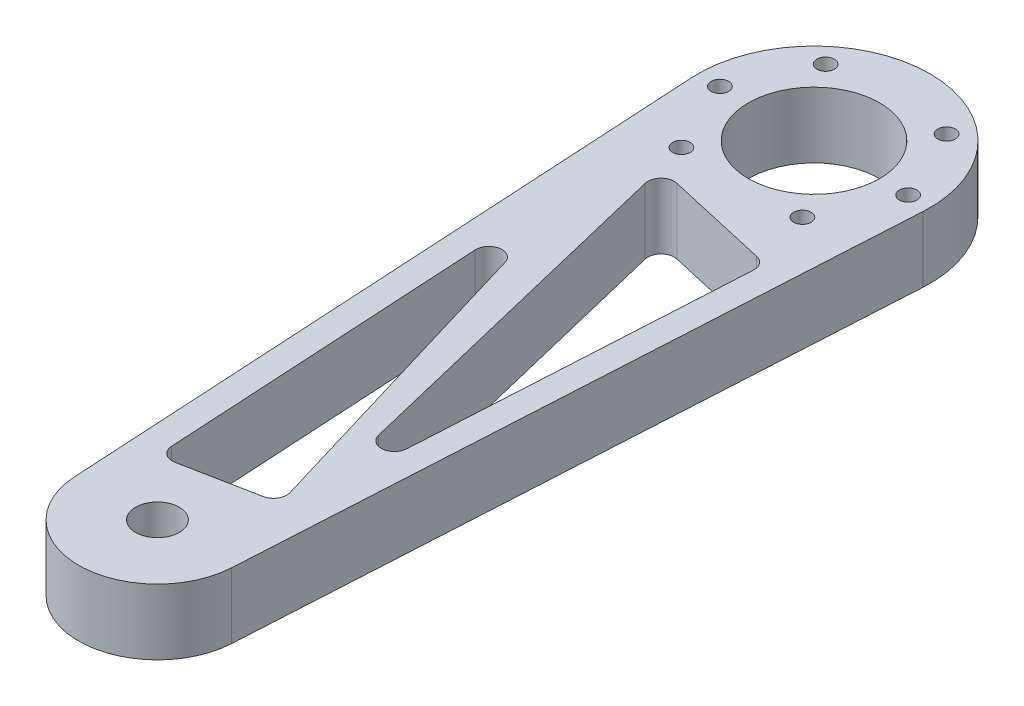
ISO-10303-21;
HEADER;
FILE_DESCRIPTION(('STEP AP214'),'2;1');
FILE_NAME('part.step','',(''),(''),'','','');
FILE_SCHEMA(('AUTOMOTIVE_DESIGN { 1 0 10303 214 1 1 1 1 }'));
ENDSEC;
DATA;
#1=APPLICATION_CONTEXT('core data for automotive mechanical design processes');
#2=APPLICATION_PROTOCOL_DEFINITION('international standard','automotive_design',2000,#1);
#3=PRODUCT_CONTEXT('',#1,'mechanical');
#4=PRODUCT('Part','Part','',(#3));
#5=PRODUCT_RELATED_PRODUCT_CATEGORY('part','',(#4));
#6=PRODUCT_DEFINITION_FORMATION('','',#4);
#7=PRODUCT_DEFINITION_CONTEXT('part definition',#1,'design');
#8=PRODUCT_DEFINITION('design','',#6,#7);
#9=PRODUCT_DEFINITION_SHAPE('','',#8);
#10=(LENGTH_UNIT() NAMED_UNIT(*) SI_UNIT(.MILLI.,.METRE.));
#11=(NAMED_UNIT(*) PLANE_ANGLE_UNIT() SI_UNIT($,.RADIAN.));
#12=(NAMED_UNIT(*) SI_UNIT($,.STERADIAN.) SOLID_ANGLE_UNIT());
#13=UNCERTAINTY_MEASURE_WITH_UNIT(LENGTH_MEASURE(1.E-05),#10,'distance_accuracy_value','');
#14=(GEOMETRIC_REPRESENTATION_CONTEXT(3) GLOBAL_UNCERTAINTY_ASSIGNED_CONTEXT((#13)) GLOBAL_UNIT_ASSIGNED_CONTEXT((#10,
#11,#12)) REPRESENTATION_CONTEXT('',''));
#15=CARTESIAN_POINT('',(0.,0.,0.));
#16=DIRECTION('',(0.,0.,1.));
#17=DIRECTION('',(1.,0.,0.));
#18=AXIS2_PLACEMENT_3D('',#15,#16,#17);
#19=CARTESIAN_POINT('',(0.,15.,0.));
#20=DIRECTION('',(0.,1.,0.));
#21=DIRECTION('',(0.,0.,1.));
#22=AXIS2_PLACEMENT_3D('',#19,#20,#21);
#23=PLANE('',#22);
#24=CARTESIAN_POINT('',(-13.8199336082606,15.,-166.469955527058));
#25=DIRECTION('',(0.,1.,0.));
#26=DIRECTION('',(-0.766044443118979,0.,0.642787609686538));
#27=AXIS2_PLACEMENT_3D('',#24,#25,#26);
#28=CIRCLE('',#27,2.);
#29=CARTESIAN_POINT('',(-15.3520224944985,15.,-165.184380307685));
#30=VERTEX_POINT('',#29);
#31=EDGE_CURVE('E369',#30,#30,#28,.T.);
#32=ORIENTED_EDGE('',*,*,#31,.F.);
#33=EDGE_LOOP('',(#32));
#34=FACE_BOUND('',#33,.T.);
#35=CARTESIAN_POINT('',(13.8199336082606,15.,-133.530044472942));
#36=DIRECTION('',(0.,1.,0.));
#37=DIRECTION('',(-0.766044443118979,0.,0.642787609686538));
#38=AXIS2_PLACEMENT_3D('',#35,#36,#37);
#39=CIRCLE('',#38,2.);
#40=CARTESIAN_POINT('',(12.2878447220226,15.,-132.244469253569));
#41=VERTEX_POINT('',#40);
#42=EDGE_CURVE('E375',#41,#41,#39,.T.);
#43=ORIENTED_EDGE('',*,*,#42,.F.);
#44=EDGE_LOOP('',(#43));
#45=FACE_BOUND('',#44,.T.);
#46=CARTESIAN_POINT('',(-13.8199336082606,15.,-133.530044472942));
#47=DIRECTION('',(0.,1.,0.));
#48=DIRECTION('',(0.766044443118979,0.,0.642787609686538));
#49=AXIS2_PLACEMENT_3D('',#46,#47,#48);
#50=CIRCLE('',#49,2.);
#51=CARTESIAN_POINT('',(-12.2878447220226,15.,-132.244469253569));
#52=VERTEX_POINT('',#51);
#53=EDGE_CURVE('E384',#52,#52,#50,.T.);
#54=ORIENTED_EDGE('',*,*,#53,.F.);
#55=EDGE_LOOP('',(#54));
#56=FACE_BOUND('',#55,.T.);
#57=CARTESIAN_POINT('',(13.8199336082606,15.,-166.469955527058));
#58=DIRECTION('',(0.,1.,0.));
#59=DIRECTION('',(0.766044443118979,0.,0.642787609686538));
#60=AXIS2_PLACEMENT_3D('',#57,#58,#59);
#61=CIRCLE('',#60,2.);
#62=CARTESIAN_POINT('',(15.3520224944985,15.,-165.184380307685));
#63=VERTEX_POINT('',#62);
#64=EDGE_CURVE('E372',#63,#63,#61,.T.);
#65=ORIENTED_EDGE('',*,*,#64,.F.);
#66=EDGE_LOOP('',(#65));
#67=FACE_BOUND('',#66,.T.);
#68=CARTESIAN_POINT('',(-21.5,15.,-150.));
#69=DIRECTION('',(0.,1.,0.));
#70=DIRECTION('',(0.,0.,1.));
#71=AXIS2_PLACEMENT_3D('',#68,#69,#70);
#72=CIRCLE('',#71,2.);
#73=CARTESIAN_POINT('',(-21.5,15.,-148.));
#74=VERTEX_POINT('',#73);
#75=EDGE_CURVE('E396',#74,#74,#72,.T.);
#76=ORIENTED_EDGE('',*,*,#75,.F.);
#77=EDGE_LOOP('',(#76));
#78=FACE_BOUND('',#77,.T.);
#79=CARTESIAN_POINT('',(21.5,15.,-150.));
#80=DIRECTION('',(0.,1.,0.));
#81=DIRECTION('',(0.,0.,1.));
#82=AXIS2_PLACEMENT_3D('',#79,#80,#81);
#83=CIRCLE('',#82,2.);
#84=CARTESIAN_POINT('',(21.5,15.,-148.));
#85=VERTEX_POINT('',#84);
#86=EDGE_CURVE('E383',#85,#85,#83,.T.);
#87=ORIENTED_EDGE('',*,*,#86,.F.);
#88=EDGE_LOOP('',(#87));
#89=FACE_BOUND('',#88,.T.);
#90=CARTESIAN_POINT('',(0.,15.,0.));
#91=DIRECTION('',(0.,1.,0.));
#92=DIRECTION('',(0.,0.,1.));
#93=AXIS2_PLACEMENT_3D('',#90,#91,#92);
#94=CIRCLE('',#93,5.);
#95=CARTESIAN_POINT('',(0.,15.,5.));
#96=VERTEX_POINT('',#95);
#97=EDGE_CURVE('E268',#96,#96,#94,.T.);
#98=ORIENTED_EDGE('',*,*,#97,.F.);
#99=EDGE_LOOP('',(#98));
#100=FACE_BOUND('',#99,.T.);
#101=CARTESIAN_POINT('',(0.,15.,0.));
#102=DIRECTION('',(0.,1.,0.));
#103=DIRECTION('',(0.,0.,1.));
#104=AXIS2_PLACEMENT_3D('',#101,#102,#103);
#105=CIRCLE('',#104,18.);
#106=CARTESIAN_POINT('',(-17.971076762398,15.,1.02));
#107=VERTEX_POINT('',#106);
#108=CARTESIAN_POINT('',(17.971076762398,15.,1.02));
#109=VERTEX_POINT('',#108);
#110=EDGE_CURVE('E160',#107,#109,#105,.T.);
#111=ORIENTED_EDGE('',*,*,#110,.T.);
#112=DIRECTION('',(0.0566666666666667,0.,-0.998393153466553));
#113=VECTOR('',#112,1.);
#114=CARTESIAN_POINT('',(17.971076762398,15.,1.02));
#115=LINE('',#114,#113);
#116=CARTESIAN_POINT('',(26.4574185668637,15.,-148.498333333333));
#117=VERTEX_POINT('',#116);
#118=EDGE_CURVE('E149',#109,#117,#115,.T.);
#119=ORIENTED_EDGE('',*,*,#118,.T.);
#120=CARTESIAN_POINT('',(0.,15.,-150.));
#121=DIRECTION('',(0.,1.,0.));
#122=DIRECTION('',(0.,0.,-1.));
#123=AXIS2_PLACEMENT_3D('',#120,#121,#122);
#124=CIRCLE('',#123,26.5);
#125=CARTESIAN_POINT('',(-26.4574185668637,15.,-148.498333333333));
#126=VERTEX_POINT('',#125);
#127=EDGE_CURVE('E159',#117,#126,#124,.T.);
#128=ORIENTED_EDGE('',*,*,#127,.T.);
#129=DIRECTION('',(0.0566666666666667,0.,0.998393153466553));
#130=VECTOR('',#129,1.);
#131=CARTESIAN_POINT('',(-17.971076762398,15.,1.02));
#132=LINE('',#131,#130);
#133=EDGE_CURVE('E165',#126,#107,#132,.T.);
#134=ORIENTED_EDGE('',*,*,#133,.T.);
#135=EDGE_LOOP('',(#111,#119,#128,#134));
#136=FACE_BOUND('',#135,.T.);
#137=CARTESIAN_POINT('',(0.,15.,-150.));
#138=DIRECTION('',(0.,1.,0.));
#139=DIRECTION('',(0.,0.,1.));
#140=AXIS2_PLACEMENT_3D('',#137,#138,#139);
#141=CIRCLE('',#140,15.);
#142=CARTESIAN_POINT('',(0.,15.,-135.));
#143=VERTEX_POINT('',#142);
#144=EDGE_CURVE('E262',#143,#143,#141,.T.);
#145=ORIENTED_EDGE('',*,*,#144,.F.);
#146=EDGE_LOOP('',(#145));
#147=FACE_BOUND('',#146,.T.);
#148=DIRECTION('',(-0.286666756449605,0.,-0.958030360033889));
#149=VECTOR('',#148,1.);
#150=CARTESIAN_POINT('',(-18.5543851913669,15.,-115.139490738387));
#151=LINE('',#150,#149);
#152=CARTESIAN_POINT('',(9.76560528215196,15.,-20.4950645568282));
#153=VERTEX_POINT('',#152);
#154=CARTESIAN_POINT('',(-11.2390630531947,15.,-90.6919378076061));
#155=VERTEX_POINT('',#154);
#156=EDGE_CURVE('E248',#153,#155,#151,.T.);
#157=ORIENTED_EDGE('',*,*,#156,.F.);
#158=CARTESIAN_POINT('',(6.8915142020503,15.,-19.6350642874794));
#159=DIRECTION('',(0.,1.,0.));
#160=DIRECTION('',(0.,0.,1.));
#161=AXIS2_PLACEMENT_3D('',#158,#159,#160);
#162=CIRCLE('',#161,3.);
#163=CARTESIAN_POINT('',(7.47066200637673,15.,-16.6914970943031));
#164=VERTEX_POINT('',#163);
#165=EDGE_CURVE('E11',#153,#164,#162,.F.);
#166=ORIENTED_EDGE('',*,*,#165,.T.);
#167=DIRECTION('',(0.981189064392104,0.,-0.19304926810881));
#168=VECTOR('',#167,1.);
#169=CARTESIAN_POINT('',(10.7128519545465,15.,-17.3293990229714));
#170=LINE('',#169,#168);
#171=CARTESIAN_POINT('',(-9.3618110753663,15.,-13.3797025311371));
#172=VERTEX_POINT('',#171);
#173=EDGE_CURVE('E246',#172,#164,#170,.T.);
#174=ORIENTED_EDGE('',*,*,#173,.F.);
#175=CARTESIAN_POINT('',(-9.94095887969273,15.,-16.3232697243134));
#176=DIRECTION('',(0.,1.,0.));
#177=DIRECTION('',(0.,0.,1.));
#178=AXIS2_PLACEMENT_3D('',#175,#176,#177);
#179=CIRCLE('',#178,3.);
#180=CARTESIAN_POINT('',(-12.9361383400924,15.,-16.1532697243134));
#181=VERTEX_POINT('',#180);
#182=EDGE_CURVE('E222',#172,#181,#179,.F.);
#183=ORIENTED_EDGE('',*,*,#182,.T.);
#184=DIRECTION('',(0.0566666666666666,0.,0.998393153466553));
#185=VECTOR('',#184,1.);
#186=CARTESIAN_POINT('',(-12.7409809539486,15.,-12.7148497565296));
#187=LINE('',#186,#185);
#188=CARTESIAN_POINT('',(-17.108333593696,15.,-89.6619375382572));
#189=VERTEX_POINT('',#188);
#190=EDGE_CURVE('E250',#189,#181,#187,.T.);
#191=ORIENTED_EDGE('',*,*,#190,.F.);
#192=CARTESIAN_POINT('',(-14.1131541332963,15.,-89.8319375382572));
#193=DIRECTION('',(0.,1.,0.));
#194=DIRECTION('',(0.,0.,1.));
#195=AXIS2_PLACEMENT_3D('',#192,#193,#194);
#196=CIRCLE('',#195,3.);
#197=EDGE_CURVE('E218',#189,#155,#196,.F.);
#198=ORIENTED_EDGE('',*,*,#197,.T.);
#199=EDGE_LOOP('',(#157,#166,#174,#183,#191,#198));
#200=FACE_BOUND('',#199,.T.);
#201=DIRECTION('',(0.234668209936248,0.,0.972075527541619));
#202=VECTOR('',#201,1.);
#203=CARTESIAN_POINT('',(-12.,15.,-127.));
#204=LINE('',#203,#202);
#205=CARTESIAN_POINT('',(-10.8653488920019,15.,-122.299889257763));
#206=VERTEX_POINT('',#205);
#207=CARTESIAN_POINT('',(8.52161939319863,15.,-41.992473829023));
#208=VERTEX_POINT('',#207);
#209=EDGE_CURVE('E407',#206,#208,#204,.T.);
#210=ORIENTED_EDGE('',*,*,#209,.F.);
#211=CARTESIAN_POINT('',(-7.94912230937701,15.,-123.003893887571));
#212=DIRECTION('',(0.,1.,0.));
#213=DIRECTION('',(0.,0.,1.));
#214=AXIS2_PLACEMENT_3D('',#211,#212,#213);
#215=CIRCLE('',#214,3.);
#216=CARTESIAN_POINT('',(-7.28487950298156,15.,-125.929433409463));
#217=VERTEX_POINT('',#216);
#218=EDGE_CURVE('E214',#206,#217,#215,.F.);
#219=ORIENTED_EDGE('',*,*,#218,.T.);
#220=DIRECTION('',(-0.975179840630658,0.,-0.221414268798477));
#221=VECTOR('',#220,1.);
#222=CARTESIAN_POINT('',(18.8302573337206,15.,-120.));
#223=LINE('',#222,#221);
#224=CARTESIAN_POINT('',(16.3555160897141,15.,-120.561889202563));
#225=VERTEX_POINT('',#224);
#226=EDGE_CURVE('E404',#225,#217,#223,.T.);
#227=ORIENTED_EDGE('',*,*,#226,.F.);
#228=CARTESIAN_POINT('',(15.6912732833187,15.,-117.636349680671));
#229=DIRECTION('',(0.,1.,0.));
#230=DIRECTION('',(0.,0.,1.));
#231=AXIS2_PLACEMENT_3D('',#228,#229,#230);
#232=CIRCLE('',#231,3.);
#233=CARTESIAN_POINT('',(18.6864527437183,15.,-117.466349680671));
#234=VERTEX_POINT('',#233);
#235=EDGE_CURVE('E210',#225,#234,#232,.F.);
#236=ORIENTED_EDGE('',*,*,#235,.T.);
#237=DIRECTION('',(0.0566666666666667,0.,-0.998393153466553));
#238=VECTOR('',#237,1.);
#239=CARTESIAN_POINT('',(13.2832157063432,15.,-22.2683226570439));
#240=LINE('',#239,#238);
#241=CARTESIAN_POINT('',(14.4330254362231,15.,-42.5264784588318));
#242=VERTEX_POINT('',#241);
#243=EDGE_CURVE('E260',#242,#234,#240,.T.);
#244=ORIENTED_EDGE('',*,*,#243,.F.);
#245=CARTESIAN_POINT('',(11.4378459758235,15.,-42.6964784588318));
#246=DIRECTION('',(0.,1.,0.));
#247=DIRECTION('',(0.,0.,1.));
#248=AXIS2_PLACEMENT_3D('',#245,#246,#247);
#249=CIRCLE('',#248,3.);
#250=EDGE_CURVE('E226',#242,#208,#249,.F.);
#251=ORIENTED_EDGE('',*,*,#250,.T.);
#252=EDGE_LOOP('',(#210,#219,#227,#236,#244,#251));
#253=FACE_BOUND('',#252,.T.);
#254=ADVANCED_FACE('F36',(#34,#45,#56,#67,#78,#89,#100,#136,#147,#200,#253),#23,.T.);
#255=CARTESIAN_POINT('',(0.,0.,0.));
#256=DIRECTION('',(0.,1.,0.));
#257=DIRECTION('',(0.,0.,1.));
#258=AXIS2_PLACEMENT_3D('',#255,#256,#257);
#259=PLANE('',#258);
#260=CARTESIAN_POINT('',(-13.8199336082606,0.,-166.469955527058));
#261=DIRECTION('',(0.,1.,0.));
#262=DIRECTION('',(-0.766044443118979,0.,0.642787609686538));
#263=AXIS2_PLACEMENT_3D('',#260,#261,#262);
#264=CIRCLE('',#263,2.);
#265=CARTESIAN_POINT('',(-15.3520224944985,0.,-165.184380307685));
#266=VERTEX_POINT('',#265);
#267=EDGE_CURVE('E367',#266,#266,#264,.T.);
#268=ORIENTED_EDGE('',*,*,#267,.T.);
#269=EDGE_LOOP('',(#268));
#270=FACE_BOUND('',#269,.T.);
#271=CARTESIAN_POINT('',(13.8199336082606,0.,-133.530044472942));
#272=DIRECTION('',(0.,1.,0.));
#273=DIRECTION('',(-0.766044443118979,0.,0.642787609686538));
#274=AXIS2_PLACEMENT_3D('',#271,#272,#273);
#275=CIRCLE('',#274,2.);
#276=CARTESIAN_POINT('',(12.2878447220226,0.,-132.244469253569));
#277=VERTEX_POINT('',#276);
#278=EDGE_CURVE('E370',#277,#277,#275,.T.);
#279=ORIENTED_EDGE('',*,*,#278,.T.);
#280=EDGE_LOOP('',(#279));
#281=FACE_BOUND('',#280,.T.);
#282=CARTESIAN_POINT('',(-13.8199336082606,0.,-133.530044472942));
#283=DIRECTION('',(0.,1.,0.));
#284=DIRECTION('',(0.766044443118979,0.,0.642787609686538));
#285=AXIS2_PLACEMENT_3D('',#282,#283,#284);
#286=CIRCLE('',#285,2.);
#287=CARTESIAN_POINT('',(-12.2878447220226,0.,-132.244469253569));
#288=VERTEX_POINT('',#287);
#289=EDGE_CURVE('E380',#288,#288,#286,.T.);
#290=ORIENTED_EDGE('',*,*,#289,.T.);
#291=EDGE_LOOP('',(#290));
#292=FACE_BOUND('',#291,.T.);
#293=CARTESIAN_POINT('',(13.8199336082606,0.,-166.469955527058));
#294=DIRECTION('',(0.,1.,0.));
#295=DIRECTION('',(0.766044443118979,0.,0.642787609686538));
#296=AXIS2_PLACEMENT_3D('',#293,#294,#295);
#297=CIRCLE('',#296,2.);
#298=CARTESIAN_POINT('',(15.3520224944985,0.,-165.184380307685));
#299=VERTEX_POINT('',#298);
#300=EDGE_CURVE('E387',#299,#299,#297,.T.);
#301=ORIENTED_EDGE('',*,*,#300,.T.);
#302=EDGE_LOOP('',(#301));
#303=FACE_BOUND('',#302,.T.);
#304=CARTESIAN_POINT('',(-21.5,0.,-150.));
#305=DIRECTION('',(0.,1.,0.));
#306=DIRECTION('',(0.,0.,1.));
#307=AXIS2_PLACEMENT_3D('',#304,#305,#306);
#308=CIRCLE('',#307,2.);
#309=CARTESIAN_POINT('',(-21.5,0.,-148.));
#310=VERTEX_POINT('',#309);
#311=EDGE_CURVE('E392',#310,#310,#308,.T.);
#312=ORIENTED_EDGE('',*,*,#311,.T.);
#313=EDGE_LOOP('',(#312));
#314=FACE_BOUND('',#313,.T.);
#315=CARTESIAN_POINT('',(21.5,0.,-150.));
#316=DIRECTION('',(0.,1.,0.));
#317=DIRECTION('',(0.,0.,1.));
#318=AXIS2_PLACEMENT_3D('',#315,#316,#317);
#319=CIRCLE('',#318,2.);
#320=CARTESIAN_POINT('',(21.5,0.,-148.));
#321=VERTEX_POINT('',#320);
#322=EDGE_CURVE('E399',#321,#321,#319,.T.);
#323=ORIENTED_EDGE('',*,*,#322,.T.);
#324=EDGE_LOOP('',(#323));
#325=FACE_BOUND('',#324,.T.);
#326=DIRECTION('',(0.0566666666666666,0.,0.998393153466553));
#327=VECTOR('',#326,1.);
#328=CARTESIAN_POINT('',(-12.7409809539486,0.,-12.7148497565296));
#329=LINE('',#328,#327);
#330=CARTESIAN_POINT('',(-17.108333593696,0.,-89.6619375382572));
#331=VERTEX_POINT('',#330);
#332=CARTESIAN_POINT('',(-12.9361383400924,0.,-16.1532697243134));
#333=VERTEX_POINT('',#332);
#334=EDGE_CURVE('E243',#331,#333,#329,.T.);
#335=ORIENTED_EDGE('',*,*,#334,.T.);
#336=CARTESIAN_POINT('',(-9.94095887969273,0.,-16.3232697243134));
#337=DIRECTION('',(0.,1.,0.));
#338=DIRECTION('',(0.,0.,1.));
#339=AXIS2_PLACEMENT_3D('',#336,#337,#338);
#340=CIRCLE('',#339,3.);
#341=CARTESIAN_POINT('',(-9.3618110753663,0.,-13.3797025311371));
#342=VERTEX_POINT('',#341);
#343=EDGE_CURVE('E220',#333,#342,#340,.T.);
#344=ORIENTED_EDGE('',*,*,#343,.T.);
#345=DIRECTION('',(0.981189064392104,0.,-0.19304926810881));
#346=VECTOR('',#345,1.);
#347=CARTESIAN_POINT('',(10.7128519545465,0.,-17.3293990229714));
#348=LINE('',#347,#346);
#349=CARTESIAN_POINT('',(7.47066200637673,0.,-16.6914970943031));
#350=VERTEX_POINT('',#349);
#351=EDGE_CURVE('E235',#342,#350,#348,.T.);
#352=ORIENTED_EDGE('',*,*,#351,.T.);
#353=CARTESIAN_POINT('',(6.8915142020503,0.,-19.6350642874794));
#354=DIRECTION('',(0.,1.,0.));
#355=DIRECTION('',(0.,0.,1.));
#356=AXIS2_PLACEMENT_3D('',#353,#354,#355);
#357=CIRCLE('',#356,3.);
#358=CARTESIAN_POINT('',(9.76560528215196,0.,-20.4950645568282));
#359=VERTEX_POINT('',#358);
#360=EDGE_CURVE('E44',#350,#359,#357,.T.);
#361=ORIENTED_EDGE('',*,*,#360,.T.);
#362=DIRECTION('',(-0.286666756449605,0.,-0.958030360033889));
#363=VECTOR('',#362,1.);
#364=CARTESIAN_POINT('',(-18.5543851913669,0.,-115.139490738387));
#365=LINE('',#364,#363);
#366=CARTESIAN_POINT('',(-11.2390630531947,0.,-90.6919378076061));
#367=VERTEX_POINT('',#366);
#368=EDGE_CURVE('E234',#359,#367,#365,.T.);
#369=ORIENTED_EDGE('',*,*,#368,.T.);
#370=CARTESIAN_POINT('',(-14.1131541332963,0.,-89.8319375382572));
#371=DIRECTION('',(0.,1.,0.));
#372=DIRECTION('',(0.,0.,1.));
#373=AXIS2_PLACEMENT_3D('',#370,#371,#372);
#374=CIRCLE('',#373,3.);
#375=EDGE_CURVE('E216',#367,#331,#374,.T.);
#376=ORIENTED_EDGE('',*,*,#375,.T.);
#377=EDGE_LOOP('',(#335,#344,#352,#361,#369,#376));
#378=FACE_BOUND('',#377,.T.);
#379=CARTESIAN_POINT('',(0.,0.,0.));
#380=DIRECTION('',(0.,1.,0.));
#381=DIRECTION('',(0.,0.,1.));
#382=AXIS2_PLACEMENT_3D('',#379,#380,#381);
#383=CIRCLE('',#382,18.);
#384=CARTESIAN_POINT('',(-17.971076762398,0.,1.02));
#385=VERTEX_POINT('',#384);
#386=CARTESIAN_POINT('',(17.971076762398,0.,1.02));
#387=VERTEX_POINT('',#386);
#388=EDGE_CURVE('E173',#385,#387,#383,.T.);
#389=ORIENTED_EDGE('',*,*,#388,.F.);
#390=DIRECTION('',(0.0566666666666667,0.,0.998393153466553));
#391=VECTOR('',#390,1.);
#392=CARTESIAN_POINT('',(-17.971076762398,0.,1.02));
#393=LINE('',#392,#391);
#394=CARTESIAN_POINT('',(-26.4574185668637,0.,-148.498333333333));
#395=VERTEX_POINT('',#394);
#396=EDGE_CURVE('E169',#395,#385,#393,.T.);
#397=ORIENTED_EDGE('',*,*,#396,.F.);
#398=CARTESIAN_POINT('',(0.,0.,-150.));
#399=DIRECTION('',(0.,1.,0.));
#400=DIRECTION('',(0.,0.,-1.));
#401=AXIS2_PLACEMENT_3D('',#398,#399,#400);
#402=CIRCLE('',#401,26.5);
#403=CARTESIAN_POINT('',(26.4574185668637,0.,-148.498333333333));
#404=VERTEX_POINT('',#403);
#405=EDGE_CURVE('E279',#404,#395,#402,.T.);
#406=ORIENTED_EDGE('',*,*,#405,.F.);
#407=DIRECTION('',(0.0566666666666667,0.,-0.998393153466553));
#408=VECTOR('',#407,1.);
#409=CARTESIAN_POINT('',(17.971076762398,0.,1.02));
#410=LINE('',#409,#408);
#411=EDGE_CURVE('E277',#387,#404,#410,.T.);
#412=ORIENTED_EDGE('',*,*,#411,.F.);
#413=EDGE_LOOP('',(#389,#397,#406,#412));
#414=FACE_BOUND('',#413,.T.);
#415=CARTESIAN_POINT('',(0.,0.,0.));
#416=DIRECTION('',(0.,1.,0.));
#417=DIRECTION('',(0.,0.,1.));
#418=AXIS2_PLACEMENT_3D('',#415,#416,#417);
#419=CIRCLE('',#418,5.);
#420=CARTESIAN_POINT('',(0.,0.,5.));
#421=VERTEX_POINT('',#420);
#422=EDGE_CURVE('E265',#421,#421,#419,.T.);
#423=ORIENTED_EDGE('',*,*,#422,.T.);
#424=EDGE_LOOP('',(#423));
#425=FACE_BOUND('',#424,.T.);
#426=CARTESIAN_POINT('',(0.,0.,-150.));
#427=DIRECTION('',(0.,1.,0.));
#428=DIRECTION('',(0.,0.,1.));
#429=AXIS2_PLACEMENT_3D('',#426,#427,#428);
#430=CIRCLE('',#429,15.);
#431=CARTESIAN_POINT('',(0.,0.,-135.));
#432=VERTEX_POINT('',#431);
#433=EDGE_CURVE('E259',#432,#432,#430,.T.);
#434=ORIENTED_EDGE('',*,*,#433,.T.);
#435=EDGE_LOOP('',(#434));
#436=FACE_BOUND('',#435,.T.);
#437=DIRECTION('',(0.0566666666666667,0.,-0.998393153466553));
#438=VECTOR('',#437,1.);
#439=CARTESIAN_POINT('',(13.2832157063432,0.,-22.2683226570439));
#440=LINE('',#439,#438);
#441=CARTESIAN_POINT('',(14.4330254362231,0.,-42.5264784588318));
#442=VERTEX_POINT('',#441);
#443=CARTESIAN_POINT('',(18.6864527437183,0.,-117.466349680671));
#444=VERTEX_POINT('',#443);
#445=EDGE_CURVE('E254',#442,#444,#440,.T.);
#446=ORIENTED_EDGE('',*,*,#445,.T.);
#447=CARTESIAN_POINT('',(15.6912732833187,0.,-117.636349680671));
#448=DIRECTION('',(0.,1.,0.));
#449=DIRECTION('',(0.,0.,1.));
#450=AXIS2_PLACEMENT_3D('',#447,#448,#449);
#451=CIRCLE('',#450,3.);
#452=CARTESIAN_POINT('',(16.3555160897141,0.,-120.561889202563));
#453=VERTEX_POINT('',#452);
#454=EDGE_CURVE('E208',#444,#453,#451,.T.);
#455=ORIENTED_EDGE('',*,*,#454,.T.);
#456=DIRECTION('',(-0.975179840630658,0.,-0.221414268798477));
#457=VECTOR('',#456,1.);
#458=CARTESIAN_POINT('',(18.8302573337206,0.,-120.));
#459=LINE('',#458,#457);
#460=CARTESIAN_POINT('',(-7.28487950298156,0.,-125.929433409463));
#461=VERTEX_POINT('',#460);
#462=EDGE_CURVE('E395',#453,#461,#459,.T.);
#463=ORIENTED_EDGE('',*,*,#462,.T.);
#464=CARTESIAN_POINT('',(-7.94912230937701,0.,-123.003893887571));
#465=DIRECTION('',(0.,1.,0.));
#466=DIRECTION('',(0.,0.,1.));
#467=AXIS2_PLACEMENT_3D('',#464,#465,#466);
#468=CIRCLE('',#467,3.);
#469=CARTESIAN_POINT('',(-10.8653488920019,0.,-122.299889257763));
#470=VERTEX_POINT('',#469);
#471=EDGE_CURVE('E212',#461,#470,#468,.T.);
#472=ORIENTED_EDGE('',*,*,#471,.T.);
#473=DIRECTION('',(0.234668209936248,0.,0.972075527541619));
#474=VECTOR('',#473,1.);
#475=CARTESIAN_POINT('',(-12.,0.,-127.));
#476=LINE('',#475,#474);
#477=CARTESIAN_POINT('',(8.52161939319863,0.,-41.992473829023));
#478=VERTEX_POINT('',#477);
#479=EDGE_CURVE('E413',#470,#478,#476,.T.);
#480=ORIENTED_EDGE('',*,*,#479,.T.);
#481=CARTESIAN_POINT('',(11.4378459758235,0.,-42.6964784588318));
#482=DIRECTION('',(0.,1.,0.));
#483=DIRECTION('',(0.,0.,1.));
#484=AXIS2_PLACEMENT_3D('',#481,#482,#483);
#485=CIRCLE('',#484,3.);
#486=EDGE_CURVE('E224',#478,#442,#485,.T.);
#487=ORIENTED_EDGE('',*,*,#486,.T.);
#488=EDGE_LOOP('',(#446,#455,#463,#472,#480,#487));
#489=FACE_BOUND('',#488,.T.);
#490=ADVANCED_FACE('F232',(#270,#281,#292,#303,#314,#325,#378,#414,#425,#436,#489),#259,.F.);
#491=CARTESIAN_POINT('',(0.,15.,0.));
#492=DIRECTION('',(0.,-1.,0.));
#493=DIRECTION('',(0.,0.,-1.));
#494=AXIS2_PLACEMENT_3D('',#491,#492,#493);
#495=CYLINDRICAL_SURFACE('',#494,18.);
#496=ORIENTED_EDGE('',*,*,#388,.T.);
#497=DIRECTION('',(0.,-1.,0.));
#498=VECTOR('',#497,1.);
#499=CARTESIAN_POINT('',(17.971076762398,15.,1.02));
#500=LINE('',#499,#498);
#501=EDGE_CURVE('E153',#109,#387,#500,.T.);
#502=ORIENTED_EDGE('',*,*,#501,.F.);
#503=ORIENTED_EDGE('',*,*,#110,.F.);
#504=DIRECTION('',(0.,-1.,0.));
#505=VECTOR('',#504,1.);
#506=CARTESIAN_POINT('',(-17.971076762398,15.,1.02));
#507=LINE('',#506,#505);
#508=EDGE_CURVE('E275',#107,#385,#507,.T.);
#509=ORIENTED_EDGE('',*,*,#508,.T.);
#510=EDGE_LOOP('',(#496,#502,#503,#509));
#511=FACE_BOUND('',#510,.T.);
#512=ADVANCED_FACE('F171',(#511),#495,.T.);
#513=CARTESIAN_POINT('',(17.971076762398,15.,1.02));
#514=DIRECTION('',(-0.998393153466554,0.,-0.0566666666666667));
#515=DIRECTION('',(-0.0566666666666667,0.,0.998393153466554));
#516=AXIS2_PLACEMENT_3D('',#513,#514,#515);
#517=PLANE('',#516);
#518=ORIENTED_EDGE('',*,*,#411,.T.);
#519=DIRECTION('',(0.,-1.,0.));
#520=VECTOR('',#519,1.);
#521=CARTESIAN_POINT('',(26.4574185668637,15.,-148.498333333333));
#522=LINE('',#521,#520);
#523=EDGE_CURVE('E156',#117,#404,#522,.T.);
#524=ORIENTED_EDGE('',*,*,#523,.F.);
#525=ORIENTED_EDGE('',*,*,#118,.F.);
#526=ORIENTED_EDGE('',*,*,#501,.T.);
#527=EDGE_LOOP('',(#518,#524,#525,#526));
#528=FACE_BOUND('',#527,.T.);
#529=ADVANCED_FACE('F151',(#528),#517,.F.);
#530=CARTESIAN_POINT('',(0.,15.,-150.));
#531=DIRECTION('',(0.,-1.,0.));
#532=DIRECTION('',(0.,0.,-1.));
#533=AXIS2_PLACEMENT_3D('',#530,#531,#532);
#534=CYLINDRICAL_SURFACE('',#533,26.5);
#535=ORIENTED_EDGE('',*,*,#405,.T.);
#536=DIRECTION('',(0.,-1.,0.));
#537=VECTOR('',#536,1.);
#538=CARTESIAN_POINT('',(-26.4574185668637,15.,-148.498333333333));
#539=LINE('',#538,#537);
#540=EDGE_CURVE('E178',#126,#395,#539,.T.);
#541=ORIENTED_EDGE('',*,*,#540,.F.);
#542=ORIENTED_EDGE('',*,*,#127,.F.);
#543=ORIENTED_EDGE('',*,*,#523,.T.);
#544=EDGE_LOOP('',(#535,#541,#542,#543));
#545=FACE_BOUND('',#544,.T.);
#546=ADVANCED_FACE('F290',(#545),#534,.T.);
#547=CARTESIAN_POINT('',(-17.971076762398,15.,1.02));
#548=DIRECTION('',(0.998393153466554,0.,-0.0566666666666667));
#549=DIRECTION('',(-0.0566666666666667,0.,-0.998393153466554));
#550=AXIS2_PLACEMENT_3D('',#547,#548,#549);
#551=PLANE('',#550);
#552=ORIENTED_EDGE('',*,*,#396,.T.);
#553=ORIENTED_EDGE('',*,*,#508,.F.);
#554=ORIENTED_EDGE('',*,*,#133,.F.);
#555=ORIENTED_EDGE('',*,*,#540,.T.);
#556=EDGE_LOOP('',(#552,#553,#554,#555));
#557=FACE_BOUND('',#556,.T.);
#558=ADVANCED_FACE('F286',(#557),#551,.F.);
#559=CARTESIAN_POINT('',(0.,15.,0.));
#560=DIRECTION('',(0.,-1.,0.));
#561=DIRECTION('',(0.,0.,-1.));
#562=AXIS2_PLACEMENT_3D('',#559,#560,#561);
#563=CYLINDRICAL_SURFACE('',#562,5.);
#564=ORIENTED_EDGE('',*,*,#97,.T.);
#565=EDGE_LOOP('',(#564));
#566=FACE_BOUND('',#565,.T.);
#567=ORIENTED_EDGE('',*,*,#422,.F.);
#568=EDGE_LOOP('',(#567));
#569=FACE_BOUND('',#568,.T.);
#570=ADVANCED_FACE('F297',(#566,#569),#563,.F.);
#571=CARTESIAN_POINT('',(0.,15.,-150.));
#572=DIRECTION('',(0.,-1.,0.));
#573=DIRECTION('',(0.,0.,-1.));
#574=AXIS2_PLACEMENT_3D('',#571,#572,#573);
#575=CYLINDRICAL_SURFACE('',#574,15.);
#576=ORIENTED_EDGE('',*,*,#144,.T.);
#577=EDGE_LOOP('',(#576));
#578=FACE_BOUND('',#577,.T.);
#579=ORIENTED_EDGE('',*,*,#433,.F.);
#580=EDGE_LOOP('',(#579));
#581=FACE_BOUND('',#580,.T.);
#582=ADVANCED_FACE('F313',(#578,#581),#575,.F.);
#583=CARTESIAN_POINT('',(10.7128519545465,15.,-17.3293990229714));
#584=DIRECTION('',(-0.19304926810881,0.,-0.981189064392104));
#585=DIRECTION('',(-0.981189064392104,0.,0.19304926810881));
#586=AXIS2_PLACEMENT_3D('',#583,#584,#585);
#587=PLANE('',#586);
#588=ORIENTED_EDGE('',*,*,#351,.F.);
#589=DIRECTION('',(0.,-1.,0.));
#590=VECTOR('',#589,1.);
#591=CARTESIAN_POINT('',(-9.3618110753663,15.,-13.3797025311371));
#592=LINE('',#591,#590);
#593=EDGE_CURVE('E56',#342,#172,#592,.F.);
#594=ORIENTED_EDGE('',*,*,#593,.T.);
#595=ORIENTED_EDGE('',*,*,#173,.T.);
#596=DIRECTION('',(0.,-1.,0.));
#597=VECTOR('',#596,1.);
#598=CARTESIAN_POINT('',(7.47066200637673,0.,-16.6914970943031));
#599=LINE('',#598,#597);
#600=EDGE_CURVE('E204',#164,#350,#599,.T.);
#601=ORIENTED_EDGE('',*,*,#600,.T.);
#602=EDGE_LOOP('',(#588,#594,#595,#601));
#603=FACE_BOUND('',#602,.T.);
#604=ADVANCED_FACE('F245',(#603),#587,.T.);
#605=CARTESIAN_POINT('',(-18.5543851913669,15.,-115.139490738387));
#606=DIRECTION('',(-0.958030360033889,0.,0.286666756449605));
#607=DIRECTION('',(0.286666756449605,0.,0.958030360033889));
#608=AXIS2_PLACEMENT_3D('',#605,#606,#607);
#609=PLANE('',#608);
#610=ORIENTED_EDGE('',*,*,#156,.T.);
#611=DIRECTION('',(0.,-1.,0.));
#612=VECTOR('',#611,1.);
#613=CARTESIAN_POINT('',(-11.2390630531947,0.,-90.6919378076061));
#614=LINE('',#613,#612);
#615=EDGE_CURVE('E196',#155,#367,#614,.T.);
#616=ORIENTED_EDGE('',*,*,#615,.T.);
#617=ORIENTED_EDGE('',*,*,#368,.F.);
#618=DIRECTION('',(0.,-1.,0.));
#619=VECTOR('',#618,1.);
#620=CARTESIAN_POINT('',(9.76560528215196,15.,-20.4950645568282));
#621=LINE('',#620,#619);
#622=EDGE_CURVE('E194',#359,#153,#621,.F.);
#623=ORIENTED_EDGE('',*,*,#622,.T.);
#624=EDGE_LOOP('',(#610,#616,#617,#623));
#625=FACE_BOUND('',#624,.T.);
#626=ADVANCED_FACE('F241',(#625),#609,.T.);
#627=CARTESIAN_POINT('',(-12.7409809539486,15.,-12.7148497565296));
#628=DIRECTION('',(0.998393153466553,0.,-0.0566666666666666));
#629=DIRECTION('',(-0.0566666666666666,0.,-0.998393153466553));
#630=AXIS2_PLACEMENT_3D('',#627,#628,#629);
#631=PLANE('',#630);
#632=ORIENTED_EDGE('',*,*,#334,.F.);
#633=DIRECTION('',(0.,-1.,0.));
#634=VECTOR('',#633,1.);
#635=CARTESIAN_POINT('',(-17.108333593696,15.,-89.6619375382572));
#636=LINE('',#635,#634);
#637=EDGE_CURVE('E202',#331,#189,#636,.F.);
#638=ORIENTED_EDGE('',*,*,#637,.T.);
#639=ORIENTED_EDGE('',*,*,#190,.T.);
#640=DIRECTION('',(0.,-1.,0.));
#641=VECTOR('',#640,1.);
#642=CARTESIAN_POINT('',(-12.9361383400924,0.,-16.1532697243134));
#643=LINE('',#642,#641);
#644=EDGE_CURVE('E199',#181,#333,#643,.T.);
#645=ORIENTED_EDGE('',*,*,#644,.T.);
#646=EDGE_LOOP('',(#632,#638,#639,#645));
#647=FACE_BOUND('',#646,.T.);
#648=ADVANCED_FACE('F322',(#647),#631,.T.);
#649=CARTESIAN_POINT('',(18.8302573337206,15.,-120.));
#650=DIRECTION('',(-0.221414268798477,0.,0.975179840630658));
#651=DIRECTION('',(0.975179840630658,0.,0.221414268798477));
#652=AXIS2_PLACEMENT_3D('',#649,#650,#651);
#653=PLANE('',#652);
#654=ORIENTED_EDGE('',*,*,#462,.F.);
#655=DIRECTION('',(0.,-1.,0.));
#656=VECTOR('',#655,1.);
#657=CARTESIAN_POINT('',(16.3555160897141,15.,-120.561889202563));
#658=LINE('',#657,#656);
#659=EDGE_CURVE('E187',#453,#225,#658,.F.);
#660=ORIENTED_EDGE('',*,*,#659,.T.);
#661=ORIENTED_EDGE('',*,*,#226,.T.);
#662=DIRECTION('',(0.,-1.,0.));
#663=VECTOR('',#662,1.);
#664=CARTESIAN_POINT('',(-7.28487950298158,0.,-125.929433409463));
#665=LINE('',#664,#663);
#666=EDGE_CURVE('E184',#217,#461,#665,.T.);
#667=ORIENTED_EDGE('',*,*,#666,.T.);
#668=EDGE_LOOP('',(#654,#660,#661,#667));
#669=FACE_BOUND('',#668,.T.);
#670=ADVANCED_FACE('F325',(#669),#653,.T.);
#671=CARTESIAN_POINT('',(-12.,15.,-127.));
#672=DIRECTION('',(0.972075527541619,0.,-0.234668209936247));
#673=DIRECTION('',(-0.234668209936248,0.,-0.972075527541619));
#674=AXIS2_PLACEMENT_3D('',#671,#672,#673);
#675=PLANE('',#674);
#676=ORIENTED_EDGE('',*,*,#479,.F.);
#677=DIRECTION('',(0.,-1.,0.));
#678=VECTOR('',#677,1.);
#679=CARTESIAN_POINT('',(-10.8653488920019,15.,-122.299889257763));
#680=LINE('',#679,#678);
#681=EDGE_CURVE('E192',#470,#206,#680,.F.);
#682=ORIENTED_EDGE('',*,*,#681,.T.);
#683=ORIENTED_EDGE('',*,*,#209,.T.);
#684=DIRECTION('',(0.,-1.,0.));
#685=VECTOR('',#684,1.);
#686=CARTESIAN_POINT('',(8.52161939319862,0.,-41.992473829023));
#687=LINE('',#686,#685);
#688=EDGE_CURVE('E189',#208,#478,#687,.T.);
#689=ORIENTED_EDGE('',*,*,#688,.T.);
#690=EDGE_LOOP('',(#676,#682,#683,#689));
#691=FACE_BOUND('',#690,.T.);
#692=ADVANCED_FACE('F329',(#691),#675,.T.);
#693=CARTESIAN_POINT('',(13.2832157063432,15.,-22.2683226570439));
#694=DIRECTION('',(-0.998393153466553,0.,-0.0566666666666667));
#695=DIRECTION('',(-0.0566666666666667,0.,0.998393153466553));
#696=AXIS2_PLACEMENT_3D('',#693,#694,#695);
#697=PLANE('',#696);
#698=ORIENTED_EDGE('',*,*,#243,.T.);
#699=DIRECTION('',(0.,-1.,0.));
#700=VECTOR('',#699,1.);
#701=CARTESIAN_POINT('',(18.6864527437183,0.,-117.466349680671));
#702=LINE('',#701,#700);
#703=EDGE_CURVE('E176',#234,#444,#702,.T.);
#704=ORIENTED_EDGE('',*,*,#703,.T.);
#705=ORIENTED_EDGE('',*,*,#445,.F.);
#706=DIRECTION('',(0.,-1.,0.));
#707=VECTOR('',#706,1.);
#708=CARTESIAN_POINT('',(14.4330254362231,15.,-42.5264784588318));
#709=LINE('',#708,#707);
#710=EDGE_CURVE('E174',#442,#242,#709,.F.);
#711=ORIENTED_EDGE('',*,*,#710,.T.);
#712=EDGE_LOOP('',(#698,#704,#705,#711));
#713=FACE_BOUND('',#712,.T.);
#714=ADVANCED_FACE('F333',(#713),#697,.T.);
#715=CARTESIAN_POINT('',(15.6912732833187,15.,-117.636349680671));
#716=DIRECTION('',(0.,1.,0.));
#717=DIRECTION('',(0.,0.,1.));
#718=AXIS2_PLACEMENT_3D('',#715,#716,#717);
#719=CYLINDRICAL_SURFACE('',#718,3.);
#720=ORIENTED_EDGE('',*,*,#235,.F.);
#721=ORIENTED_EDGE('',*,*,#659,.F.);
#722=ORIENTED_EDGE('',*,*,#454,.F.);
#723=ORIENTED_EDGE('',*,*,#703,.F.);
#724=EDGE_LOOP('',(#720,#721,#722,#723));
#725=FACE_BOUND('',#724,.T.);
#726=ADVANCED_FACE('F337',(#725),#719,.F.);
#727=CARTESIAN_POINT('',(-7.94912230937701,15.,-123.003893887571));
#728=DIRECTION('',(0.,1.,0.));
#729=DIRECTION('',(0.,0.,1.));
#730=AXIS2_PLACEMENT_3D('',#727,#728,#729);
#731=CYLINDRICAL_SURFACE('',#730,3.);
#732=ORIENTED_EDGE('',*,*,#218,.F.);
#733=ORIENTED_EDGE('',*,*,#681,.F.);
#734=ORIENTED_EDGE('',*,*,#471,.F.);
#735=ORIENTED_EDGE('',*,*,#666,.F.);
#736=EDGE_LOOP('',(#732,#733,#734,#735));
#737=FACE_BOUND('',#736,.T.);
#738=ADVANCED_FACE('F432',(#737),#731,.F.);
#739=CARTESIAN_POINT('',(-14.1131541332963,15.,-89.8319375382572));
#740=DIRECTION('',(0.,1.,0.));
#741=DIRECTION('',(0.,0.,1.));
#742=AXIS2_PLACEMENT_3D('',#739,#740,#741);
#743=CYLINDRICAL_SURFACE('',#742,3.);
#744=ORIENTED_EDGE('',*,*,#197,.F.);
#745=ORIENTED_EDGE('',*,*,#637,.F.);
#746=ORIENTED_EDGE('',*,*,#375,.F.);
#747=ORIENTED_EDGE('',*,*,#615,.F.);
#748=EDGE_LOOP('',(#744,#745,#746,#747));
#749=FACE_BOUND('',#748,.T.);
#750=ADVANCED_FACE('F443',(#749),#743,.F.);
#751=CARTESIAN_POINT('',(-9.94095887969273,15.,-16.3232697243134));
#752=DIRECTION('',(0.,1.,0.));
#753=DIRECTION('',(0.,0.,1.));
#754=AXIS2_PLACEMENT_3D('',#751,#752,#753);
#755=CYLINDRICAL_SURFACE('',#754,3.);
#756=ORIENTED_EDGE('',*,*,#182,.F.);
#757=ORIENTED_EDGE('',*,*,#593,.F.);
#758=ORIENTED_EDGE('',*,*,#343,.F.);
#759=ORIENTED_EDGE('',*,*,#644,.F.);
#760=EDGE_LOOP('',(#756,#757,#758,#759));
#761=FACE_BOUND('',#760,.T.);
#762=ADVANCED_FACE('F449',(#761),#755,.F.);
#763=CARTESIAN_POINT('',(11.4378459758235,15.,-42.6964784588318));
#764=DIRECTION('',(0.,1.,0.));
#765=DIRECTION('',(0.,0.,1.));
#766=AXIS2_PLACEMENT_3D('',#763,#764,#765);
#767=CYLINDRICAL_SURFACE('',#766,3.);
#768=ORIENTED_EDGE('',*,*,#250,.F.);
#769=ORIENTED_EDGE('',*,*,#710,.F.);
#770=ORIENTED_EDGE('',*,*,#486,.F.);
#771=ORIENTED_EDGE('',*,*,#688,.F.);
#772=EDGE_LOOP('',(#768,#769,#770,#771));
#773=FACE_BOUND('',#772,.T.);
#774=ADVANCED_FACE('F425',(#773),#767,.F.);
#775=CARTESIAN_POINT('',(6.8915142020503,15.,-19.6350642874794));
#776=DIRECTION('',(0.,1.,0.));
#777=DIRECTION('',(0.,0.,1.));
#778=AXIS2_PLACEMENT_3D('',#775,#776,#777);
#779=CYLINDRICAL_SURFACE('',#778,3.);
#780=ORIENTED_EDGE('',*,*,#165,.F.);
#781=ORIENTED_EDGE('',*,*,#622,.F.);
#782=ORIENTED_EDGE('',*,*,#360,.F.);
#783=ORIENTED_EDGE('',*,*,#600,.F.);
#784=EDGE_LOOP('',(#780,#781,#782,#783));
#785=FACE_BOUND('',#784,.T.);
#786=ADVANCED_FACE('F38',(#785),#779,.F.);
#787=CARTESIAN_POINT('',(21.5,0.,-150.));
#788=DIRECTION('',(0.,1.,0.));
#789=DIRECTION('',(0.,0.,1.));
#790=AXIS2_PLACEMENT_3D('',#787,#788,#789);
#791=CYLINDRICAL_SURFACE('',#790,2.);
#792=ORIENTED_EDGE('',*,*,#322,.F.);
#793=EDGE_LOOP('',(#792));
#794=FACE_BOUND('',#793,.T.);
#795=ORIENTED_EDGE('',*,*,#86,.T.);
#796=EDGE_LOOP('',(#795));
#797=FACE_BOUND('',#796,.T.);
#798=ADVANCED_FACE('F339',(#794,#797),#791,.F.);
#799=CARTESIAN_POINT('',(-21.5,0.,-150.));
#800=DIRECTION('',(0.,1.,0.));
#801=DIRECTION('',(0.,0.,1.));
#802=AXIS2_PLACEMENT_3D('',#799,#800,#801);
#803=CYLINDRICAL_SURFACE('',#802,2.);
#804=ORIENTED_EDGE('',*,*,#311,.F.);
#805=EDGE_LOOP('',(#804));
#806=FACE_BOUND('',#805,.T.);
#807=ORIENTED_EDGE('',*,*,#75,.T.);
#808=EDGE_LOOP('',(#807));
#809=FACE_BOUND('',#808,.T.);
#810=ADVANCED_FACE('F342',(#806,#809),#803,.F.);
#811=CARTESIAN_POINT('',(13.8199336082606,0.,-166.469955527058));
#812=DIRECTION('',(0.,1.,0.));
#813=DIRECTION('',(0.,0.,1.));
#814=AXIS2_PLACEMENT_3D('',#811,#812,#813);
#815=CYLINDRICAL_SURFACE('',#814,2.);
#816=ORIENTED_EDGE('',*,*,#300,.F.);
#817=EDGE_LOOP('',(#816));
#818=FACE_BOUND('',#817,.T.);
#819=ORIENTED_EDGE('',*,*,#64,.T.);
#820=EDGE_LOOP('',(#819));
#821=FACE_BOUND('',#820,.T.);
#822=ADVANCED_FACE('F346',(#818,#821),#815,.F.);
#823=CARTESIAN_POINT('',(-13.8199336082606,0.,-133.530044472942));
#824=DIRECTION('',(0.,1.,0.));
#825=DIRECTION('',(0.,0.,1.));
#826=AXIS2_PLACEMENT_3D('',#823,#824,#825);
#827=CYLINDRICAL_SURFACE('',#826,2.);
#828=ORIENTED_EDGE('',*,*,#289,.F.);
#829=EDGE_LOOP('',(#828));
#830=FACE_BOUND('',#829,.T.);
#831=ORIENTED_EDGE('',*,*,#53,.T.);
#832=EDGE_LOOP('',(#831));
#833=FACE_BOUND('',#832,.T.);
#834=ADVANCED_FACE('F350',(#830,#833),#827,.F.);
#835=CARTESIAN_POINT('',(13.8199336082606,0.,-133.530044472942));
#836=DIRECTION('',(0.,1.,0.));
#837=DIRECTION('',(0.,0.,1.));
#838=AXIS2_PLACEMENT_3D('',#835,#836,#837);
#839=CYLINDRICAL_SURFACE('',#838,2.);
#840=ORIENTED_EDGE('',*,*,#278,.F.);
#841=EDGE_LOOP('',(#840));
#842=FACE_BOUND('',#841,.T.);
#843=ORIENTED_EDGE('',*,*,#42,.T.);
#844=EDGE_LOOP('',(#843));
#845=FACE_BOUND('',#844,.T.);
#846=ADVANCED_FACE('F354',(#842,#845),#839,.F.);
#847=CARTESIAN_POINT('',(-13.8199336082606,0.,-166.469955527058));
#848=DIRECTION('',(0.,1.,0.));
#849=DIRECTION('',(0.,0.,1.));
#850=AXIS2_PLACEMENT_3D('',#847,#848,#849);
#851=CYLINDRICAL_SURFACE('',#850,2.);
#852=ORIENTED_EDGE('',*,*,#267,.F.);
#853=EDGE_LOOP('',(#852));
#854=FACE_BOUND('',#853,.T.);
#855=ORIENTED_EDGE('',*,*,#31,.T.);
#856=EDGE_LOOP('',(#855));
#857=FACE_BOUND('',#856,.T.);
#858=ADVANCED_FACE('F358',(#854,#857),#851,.F.);
#859=CLOSED_SHELL('',(#254,#490,#512,#529,#546,#558,#570,#582,#604,#626,#648,#670,#692,#714,
#726,#738,#750,#762,#774,#786,#798,#810,#822,#834,#846,#858));
#860=MANIFOLD_SOLID_BREP('B2',#859);
#861=ADVANCED_BREP_SHAPE_REPRESENTATION('',(#18,#860),#14);
#862=SHAPE_DEFINITION_REPRESENTATION(#9,#861);
ENDSEC;
END-ISO-10303-21;
